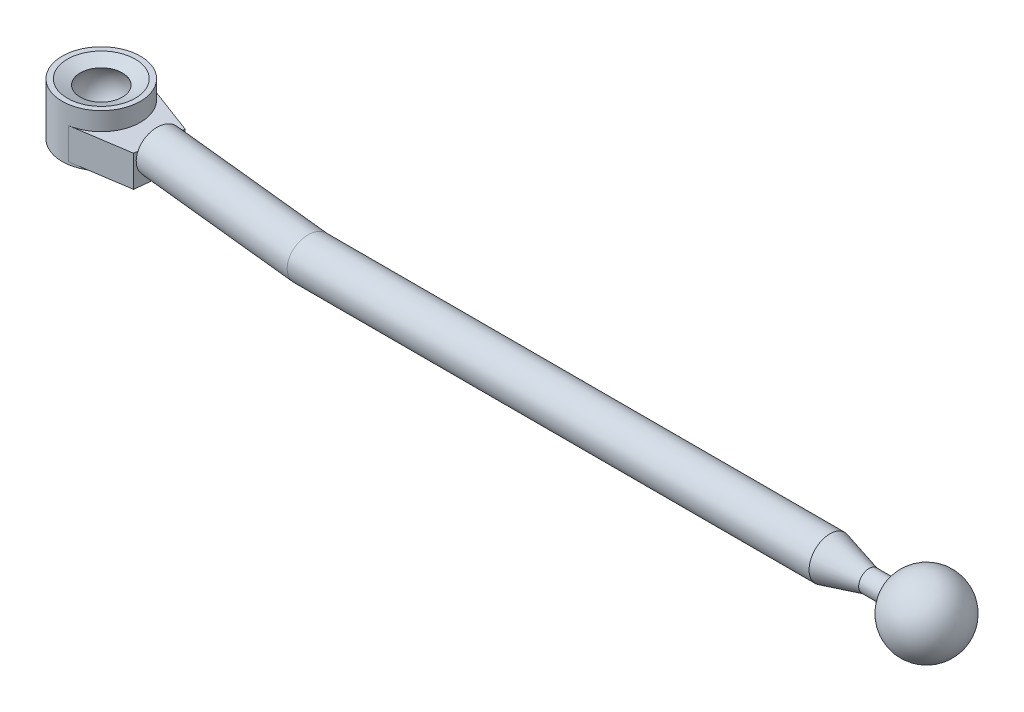
ISO-10303-21;
HEADER;
FILE_DESCRIPTION(('STEP AP214'),'2;1');
FILE_NAME('part.step','',(''),(''),'','','');
FILE_SCHEMA(('AUTOMOTIVE_DESIGN { 1 0 10303 214 1 1 1 1 }'));
ENDSEC;
DATA;
#1=APPLICATION_CONTEXT('core data for automotive mechanical design processes');
#2=APPLICATION_PROTOCOL_DEFINITION('international standard','automotive_design',2000,#1);
#3=PRODUCT_CONTEXT('',#1,'mechanical');
#4=PRODUCT('Part','Part','',(#3));
#5=PRODUCT_RELATED_PRODUCT_CATEGORY('part','',(#4));
#6=PRODUCT_DEFINITION_FORMATION('','',#4);
#7=PRODUCT_DEFINITION_CONTEXT('part definition',#1,'design');
#8=PRODUCT_DEFINITION('design','',#6,#7);
#9=PRODUCT_DEFINITION_SHAPE('','',#8);
#10=(LENGTH_UNIT() NAMED_UNIT(*) SI_UNIT(.MILLI.,.METRE.));
#11=(NAMED_UNIT(*) PLANE_ANGLE_UNIT() SI_UNIT($,.RADIAN.));
#12=(NAMED_UNIT(*) SI_UNIT($,.STERADIAN.) SOLID_ANGLE_UNIT());
#13=UNCERTAINTY_MEASURE_WITH_UNIT(LENGTH_MEASURE(1.E-05),#10,'distance_accuracy_value','');
#14=(GEOMETRIC_REPRESENTATION_CONTEXT(3) GLOBAL_UNCERTAINTY_ASSIGNED_CONTEXT((#13)) GLOBAL_UNIT_ASSIGNED_CONTEXT((#10,
#11,#12)) REPRESENTATION_CONTEXT('',''));
#15=CARTESIAN_POINT('',(0.,0.,0.));
#16=DIRECTION('',(0.,0.,1.));
#17=DIRECTION('',(1.,0.,0.));
#18=AXIS2_PLACEMENT_3D('',#15,#16,#17);
#19=CARTESIAN_POINT('',(-237.,0.,0.));
#20=DIRECTION('',(0.,0.,1.));
#21=DIRECTION('',(0.,1.,0.));
#22=AXIS2_PLACEMENT_3D('',#19,#20,#21);
#23=SPHERICAL_SURFACE('',#22,14.);
#24=CARTESIAN_POINT('',(-237.,0.,0.));
#25=DIRECTION('',(-1.,0.,0.));
#26=DIRECTION('',(0.,0.,1.));
#27=AXIS2_PLACEMENT_3D('',#24,#25,#26);
#28=SPHERICAL_SURFACE('',#27,14.);
#29=CARTESIAN_POINT('',(-250.416407864999,0.,0.));
#30=DIRECTION('',(-0.999999999999999,0.,0.));
#31=DIRECTION('',(0.,0.,1.));
#32=AXIS2_PLACEMENT_3D('',#29,#30,#31);
#33=CIRCLE('',#32,4.);
#34=CARTESIAN_POINT('',(-250.416407864999,0.,4.));
#35=VERTEX_POINT('',#34);
#36=EDGE_CURVE('E164',#35,#35,#33,.F.);
#37=ORIENTED_EDGE('',*,*,#36,.T.);
#38=EDGE_LOOP('',(#37));
#39=FACE_BOUND('',#38,.T.);
#40=ADVANCED_FACE('F41',(#39),#28,.T.);
#41=CARTESIAN_POINT('',(-259.,0.,0.));
#42=DIRECTION('',(1.,0.,0.));
#43=DIRECTION('',(0.,0.,1.));
#44=AXIS2_PLACEMENT_3D('',#41,#42,#43);
#45=CYLINDRICAL_SURFACE('',#44,4.);
#46=CARTESIAN_POINT('',(-259.,0.,0.));
#47=DIRECTION('',(1.,0.,0.));
#48=DIRECTION('',(0.,0.,-1.));
#49=AXIS2_PLACEMENT_3D('',#46,#47,#48);
#50=CIRCLE('',#49,4.);
#51=CARTESIAN_POINT('',(-259.,0.,-4.));
#52=VERTEX_POINT('',#51);
#53=EDGE_CURVE('E167',#52,#52,#50,.T.);
#54=ORIENTED_EDGE('',*,*,#53,.T.);
#55=EDGE_LOOP('',(#54));
#56=FACE_BOUND('',#55,.T.);
#57=ORIENTED_EDGE('',*,*,#36,.F.);
#58=EDGE_LOOP('',(#57));
#59=FACE_BOUND('',#58,.T.);
#60=ADVANCED_FACE('F153',(#56,#59),#45,.T.);
#61=CARTESIAN_POINT('',(-259.,0.,0.));
#62=DIRECTION('',(-1.,0.,0.));
#63=DIRECTION('',(0.,0.,-1.));
#64=AXIS2_PLACEMENT_3D('',#61,#62,#63);
#65=CONICAL_SURFACE('',#64,4.,0.261799387799149);
#66=CARTESIAN_POINT('',(-274.,0.,0.));
#67=DIRECTION('',(1.,0.,0.));
#68=DIRECTION('',(0.,0.,-1.));
#69=AXIS2_PLACEMENT_3D('',#66,#67,#68);
#70=CIRCLE('',#69,8.01923788646685);
#71=CARTESIAN_POINT('',(-274.,0.,-8.01923788646685));
#72=VERTEX_POINT('',#71);
#73=EDGE_CURVE('E135',#72,#72,#70,.T.);
#74=ORIENTED_EDGE('',*,*,#73,.T.);
#75=EDGE_LOOP('',(#74));
#76=FACE_BOUND('',#75,.T.);
#77=ORIENTED_EDGE('',*,*,#53,.F.);
#78=EDGE_LOOP('',(#77));
#79=FACE_BOUND('',#78,.T.);
#80=ADVANCED_FACE('F149',(#76,#79),#65,.T.);
#81=CARTESIAN_POINT('',(-474.,0.,0.));
#82=DIRECTION('',(1.,0.,0.));
#83=DIRECTION('',(0.,0.,1.));
#84=AXIS2_PLACEMENT_3D('',#81,#82,#83);
#85=CYLINDRICAL_SURFACE('',#84,8.01923788646685);
#86=CARTESIAN_POINT('',(-473.15714413453,0.,0.));
#87=DIRECTION('',(0.994521895368274,0.,0.104528463267644));
#88=DIRECTION('',(0.104528463267644,0.,-0.994521895368274));
#89=AXIS2_PLACEMENT_3D('',#86,#87,#88);
#90=ELLIPSE('',#89,8.06341009063184,8.01923788646685);
#91=CARTESIAN_POINT('',(-472.314288269059,0.,-8.01923788646685));
#92=VERTEX_POINT('',#91);
#93=EDGE_CURVE('E130',#92,#92,#90,.T.);
#94=ORIENTED_EDGE('',*,*,#93,.T.);
#95=EDGE_LOOP('',(#94));
#96=FACE_BOUND('',#95,.T.);
#97=ORIENTED_EDGE('',*,*,#73,.F.);
#98=EDGE_LOOP('',(#97));
#99=FACE_BOUND('',#98,.T.);
#100=ADVANCED_FACE('F144',(#96,#99),#85,.T.);
#101=CARTESIAN_POINT('',(-537.801067333467,0.,-6.79435011239686));
#102=DIRECTION('',(0.994521895368274,0.,0.104528463267644));
#103=DIRECTION('',(0.104528463267644,0.,-0.994521895368274));
#104=AXIS2_PLACEMENT_3D('',#101,#102,#103);
#105=ELLIPSE('',#104,8.06341009063184,8.01923788646685);
#106=DIRECTION('',(0.994521895368274,0.,0.104528463267644));
#107=VECTOR('',#106,1.);
#108=SURFACE_OF_LINEAR_EXTRUSION('',#105,#107);
#109=CARTESIAN_POINT('',(-537.019412737421,3.,-14.231296816505));
#110=VERTEX_POINT('',#109);
#111=CARTESIAN_POINT('',(-538.582721929514,3.,0.642596591711303));
#112=VERTEX_POINT('',#111);
#113=EDGE_CURVE('E131',#110,#112,#105,.T.);
#114=ORIENTED_EDGE('',*,*,#113,.T.);
#115=EDGE_CURVE('E136',#112,#110,#105,.T.);
#116=ORIENTED_EDGE('',*,*,#115,.T.);
#117=EDGE_LOOP('',(#114,#116));
#118=FACE_BOUND('',#117,.T.);
#119=ORIENTED_EDGE('',*,*,#93,.F.);
#120=EDGE_LOOP('',(#119));
#121=FACE_BOUND('',#120,.T.);
#122=ADVANCED_FACE('F139',(#118,#121),#108,.T.);
#123=CARTESIAN_POINT('',(-537.801067333467,0.,-6.79435011239686));
#124=DIRECTION('',(-0.994521895368274,0.,-0.104528463267644));
#125=DIRECTION('',(0.104528463267644,0.,-0.994521895368274));
#126=AXIS2_PLACEMENT_3D('',#123,#124,#125);
#127=PLANE('',#126);
#128=DIRECTION('',(-0.104528463267639,0.,0.994521895368275));
#129=VECTOR('',#128,1.);
#130=CARTESIAN_POINT('',(-538.741823502876,3.,2.15634694591763));
#131=LINE('',#130,#129);
#132=EDGE_CURVE('E166',#110,#112,#131,.T.);
#133=ORIENTED_EDGE('',*,*,#132,.T.);
#134=ORIENTED_EDGE('',*,*,#113,.F.);
#135=EDGE_LOOP('',(#133,#134));
#136=FACE_BOUND('',#135,.T.);
#137=ADVANCED_FACE('F143',(#136),#127,.T.);
#138=CARTESIAN_POINT('',(-538.741823502876,3.,2.15634694591763));
#139=DIRECTION('',(-0.994521895368275,0.,-0.104528463267639));
#140=DIRECTION('',(0.104528463267639,0.,-0.994521895368275));
#141=AXIS2_PLACEMENT_3D('',#138,#139,#140);
#142=PLANE('',#141);
#143=CARTESIAN_POINT('',(-538.741823502876,3.,2.15634694591763));
#144=VERTEX_POINT('',#143);
#145=EDGE_CURVE('E63',#112,#144,#131,.T.);
#146=ORIENTED_EDGE('',*,*,#145,.T.);
#147=DIRECTION('',(0.,-1.,0.));
#148=VECTOR('',#147,1.);
#149=CARTESIAN_POINT('',(-538.741823502876,3.,2.15634694591763));
#150=LINE('',#149,#148);
#151=CARTESIAN_POINT('',(-538.741823502876,-9.,2.15634694591763));
#152=VERTEX_POINT('',#151);
#153=EDGE_CURVE('E126',#144,#152,#150,.T.);
#154=ORIENTED_EDGE('',*,*,#153,.T.);
#155=DIRECTION('',(-0.104528463267639,0.,0.994521895368275));
#156=VECTOR('',#155,1.);
#157=CARTESIAN_POINT('',(-538.741823502876,-9.,2.15634694591763));
#158=LINE('',#157,#156);
#159=CARTESIAN_POINT('',(-536.860311164059,-9.,-15.7450471707113));
#160=VERTEX_POINT('',#159);
#161=EDGE_CURVE('E114',#160,#152,#158,.T.);
#162=ORIENTED_EDGE('',*,*,#161,.F.);
#163=DIRECTION('',(0.,-1.,0.));
#164=VECTOR('',#163,1.);
#165=CARTESIAN_POINT('',(-536.860311164059,3.,-15.7450471707113));
#166=LINE('',#165,#164);
#167=CARTESIAN_POINT('',(-536.860311164059,3.,-15.7450471707113));
#168=VERTEX_POINT('',#167);
#169=EDGE_CURVE('E112',#168,#160,#166,.T.);
#170=ORIENTED_EDGE('',*,*,#169,.F.);
#171=EDGE_CURVE('E56',#168,#110,#131,.T.);
#172=ORIENTED_EDGE('',*,*,#171,.T.);
#173=ORIENTED_EDGE('',*,*,#115,.F.);
#174=EDGE_LOOP('',(#146,#154,#162,#170,#172,#173));
#175=FACE_BOUND('',#174,.T.);
#176=ADVANCED_FACE('F204',(#175),#142,.F.);
#177=CARTESIAN_POINT('',(-536.860311164059,3.,-15.7450471707113));
#178=DIRECTION('',(-0.351367061986771,0.,0.936237783765847));
#179=DIRECTION('',(-0.936237783765847,0.,-0.351367061986771));
#180=AXIS2_PLACEMENT_3D('',#177,#178,#179);
#181=PLANE('',#180);
#182=DIRECTION('',(0.936237783765847,0.,0.351367061986771));
#183=VECTOR('',#182,1.);
#184=CARTESIAN_POINT('',(-536.860311164059,-9.,-15.7450471707113));
#185=LINE('',#184,#183);
#186=CARTESIAN_POINT('',(-557.393608787873,-9.,-23.4511284505755));
#187=VERTEX_POINT('',#186);
#188=EDGE_CURVE('E94',#187,#160,#185,.T.);
#189=ORIENTED_EDGE('',*,*,#188,.F.);
#190=DIRECTION('',(0.,-1.,0.));
#191=VECTOR('',#190,1.);
#192=CARTESIAN_POINT('',(-557.393608787873,3.,-23.4511284505755));
#193=LINE('',#192,#191);
#194=CARTESIAN_POINT('',(-557.393608787873,3.,-23.4511284505755));
#195=VERTEX_POINT('',#194);
#196=EDGE_CURVE('E103',#195,#187,#193,.T.);
#197=ORIENTED_EDGE('',*,*,#196,.F.);
#198=DIRECTION('',(0.936237783765847,0.,0.351367061986771));
#199=VECTOR('',#198,1.);
#200=CARTESIAN_POINT('',(-536.860311164059,3.,-15.7450471707113));
#201=LINE('',#200,#199);
#202=EDGE_CURVE('E100',#195,#168,#201,.T.);
#203=ORIENTED_EDGE('',*,*,#202,.T.);
#204=ORIENTED_EDGE('',*,*,#169,.T.);
#205=EDGE_LOOP('',(#189,#197,#203,#204));
#206=FACE_BOUND('',#205,.T.);
#207=ADVANCED_FACE('F111',(#206),#181,.F.);
#208=CARTESIAN_POINT('',(-538.741823502876,3.,2.15634694591763));
#209=DIRECTION('',(-0.149034068029049,0.,-0.988832061862232));
#210=DIRECTION('',(0.988832061862232,0.,-0.149034068029049));
#211=AXIS2_PLACEMENT_3D('',#208,#209,#210);
#212=PLANE('',#211);
#213=DIRECTION('',(-0.988832061862232,0.,0.149034068029049));
#214=VECTOR('',#213,1.);
#215=CARTESIAN_POINT('',(-538.741823502876,-9.,2.15634694591763));
#216=LINE('',#215,#214);
#217=CARTESIAN_POINT('',(-560.428603697239,-9.,5.42491923384569));
#218=VERTEX_POINT('',#217);
#219=EDGE_CURVE('E96',#152,#218,#216,.T.);
#220=ORIENTED_EDGE('',*,*,#219,.F.);
#221=ORIENTED_EDGE('',*,*,#153,.F.);
#222=DIRECTION('',(-0.988832061862232,0.,0.149034068029049));
#223=VECTOR('',#222,1.);
#224=CARTESIAN_POINT('',(-538.741823502876,3.,2.15634694591763));
#225=LINE('',#224,#223);
#226=CARTESIAN_POINT('',(-560.428603697239,3.,5.42491923384569));
#227=VERTEX_POINT('',#226);
#228=EDGE_CURVE('E310',#144,#227,#225,.T.);
#229=ORIENTED_EDGE('',*,*,#228,.T.);
#230=DIRECTION('',(0.,-1.,0.));
#231=VECTOR('',#230,1.);
#232=CARTESIAN_POINT('',(-560.428603697239,3.,5.42491923384569));
#233=LINE('',#232,#231);
#234=EDGE_CURVE('E109',#227,#218,#233,.T.);
#235=ORIENTED_EDGE('',*,*,#234,.T.);
#236=EDGE_LOOP('',(#220,#221,#229,#235));
#237=FACE_BOUND('',#236,.T.);
#238=ADVANCED_FACE('F198',(#237),#212,.F.);
#239=CARTESIAN_POINT('',(-562.664114717674,3.,-9.40756169408781));
#240=DIRECTION('',(0.,1.,0.));
#241=DIRECTION('',(0.,0.,1.));
#242=AXIS2_PLACEMENT_3D('',#239,#240,#241);
#243=PLANE('',#242);
#244=ORIENTED_EDGE('',*,*,#202,.F.);
#245=CARTESIAN_POINT('',(-562.664114717674,3.,-9.40756169408781));
#246=DIRECTION('',(0.,1.,0.));
#247=DIRECTION('',(0.,0.,1.));
#248=AXIS2_PLACEMENT_3D('',#245,#246,#247);
#249=CIRCLE('',#248,15.);
#250=EDGE_CURVE('E106',#227,#195,#249,.T.);
#251=ORIENTED_EDGE('',*,*,#250,.F.);
#252=ORIENTED_EDGE('',*,*,#228,.F.);
#253=ORIENTED_EDGE('',*,*,#145,.F.);
#254=ORIENTED_EDGE('',*,*,#132,.F.);
#255=ORIENTED_EDGE('',*,*,#171,.F.);
#256=EDGE_LOOP('',(#244,#251,#252,#253,#254,#255));
#257=FACE_BOUND('',#256,.T.);
#258=ADVANCED_FACE('F195',(#257),#243,.T.);
#259=CARTESIAN_POINT('',(-562.664114717674,-9.,-9.40756169408781));
#260=DIRECTION('',(0.,1.,0.));
#261=DIRECTION('',(0.,0.,1.));
#262=AXIS2_PLACEMENT_3D('',#259,#260,#261);
#263=PLANE('',#262);
#264=ORIENTED_EDGE('',*,*,#188,.T.);
#265=ORIENTED_EDGE('',*,*,#161,.T.);
#266=ORIENTED_EDGE('',*,*,#219,.T.);
#267=CARTESIAN_POINT('',(-562.664114717674,-9.,-9.40756169408781));
#268=DIRECTION('',(0.,1.,0.));
#269=DIRECTION('',(0.,0.,1.));
#270=AXIS2_PLACEMENT_3D('',#267,#268,#269);
#271=CIRCLE('',#270,15.);
#272=EDGE_CURVE('E89',#218,#187,#271,.T.);
#273=ORIENTED_EDGE('',*,*,#272,.T.);
#274=EDGE_LOOP('',(#264,#265,#266,#273));
#275=FACE_BOUND('',#274,.T.);
#276=ADVANCED_FACE('F91',(#275),#263,.F.);
#277=CARTESIAN_POINT('',(-562.664114717674,10.,-9.40756169408781));
#278=DIRECTION('',(0.,-1.,0.));
#279=DIRECTION('',(0.,0.,-1.));
#280=AXIS2_PLACEMENT_3D('',#277,#278,#279);
#281=CYLINDRICAL_SURFACE('',#280,15.);
#282=ORIENTED_EDGE('',*,*,#250,.T.);
#283=ORIENTED_EDGE('',*,*,#196,.T.);
#284=ORIENTED_EDGE('',*,*,#272,.F.);
#285=ORIENTED_EDGE('',*,*,#234,.F.);
#286=EDGE_LOOP('',(#282,#283,#284,#285));
#287=FACE_BOUND('',#286,.T.);
#288=CARTESIAN_POINT('',(-562.664114717674,10.,-9.40756169408781));
#289=DIRECTION('',(0.,-1.,0.));
#290=DIRECTION('',(0.,0.,1.));
#291=AXIS2_PLACEMENT_3D('',#288,#289,#290);
#292=CIRCLE('',#291,15.);
#293=CARTESIAN_POINT('',(-562.664114717674,10.,5.59243830591222));
#294=VERTEX_POINT('',#293);
#295=EDGE_CURVE('E115',#294,#294,#292,.T.);
#296=ORIENTED_EDGE('',*,*,#295,.T.);
#297=EDGE_LOOP('',(#296));
#298=FACE_BOUND('',#297,.T.);
#299=CARTESIAN_POINT('',(-562.664114717674,-10.,-9.40756169408781));
#300=DIRECTION('',(0.,-1.,0.));
#301=DIRECTION('',(0.,0.,1.));
#302=AXIS2_PLACEMENT_3D('',#299,#300,#301);
#303=CIRCLE('',#302,15.);
#304=CARTESIAN_POINT('',(-562.664114717674,-10.,5.59243830591222));
#305=VERTEX_POINT('',#304);
#306=EDGE_CURVE('E119',#305,#305,#303,.T.);
#307=ORIENTED_EDGE('',*,*,#306,.F.);
#308=EDGE_LOOP('',(#307));
#309=FACE_BOUND('',#308,.T.);
#310=ADVANCED_FACE('F104',(#287,#298,#309),#281,.T.);
#311=CARTESIAN_POINT('',(-562.664114717674,10.,-9.40756169408781));
#312=DIRECTION('',(0.,1.,0.));
#313=DIRECTION('',(0.,0.,1.));
#314=AXIS2_PLACEMENT_3D('',#311,#312,#313);
#315=PLANE('',#314);
#316=CARTESIAN_POINT('',(-562.664114717674,10.,-9.40756169408781));
#317=DIRECTION('',(0.,-1.,0.));
#318=DIRECTION('',(0.,0.,1.));
#319=AXIS2_PLACEMENT_3D('',#316,#317,#318);
#320=CIRCLE('',#319,13.);
#321=CARTESIAN_POINT('',(-562.664114717674,10.,3.59243830591219));
#322=VERTEX_POINT('',#321);
#323=EDGE_CURVE('E11',#322,#322,#320,.F.);
#324=ORIENTED_EDGE('',*,*,#323,.F.);
#325=EDGE_LOOP('',(#324));
#326=FACE_BOUND('',#325,.T.);
#327=ORIENTED_EDGE('',*,*,#295,.F.);
#328=EDGE_LOOP('',(#327));
#329=FACE_BOUND('',#328,.T.);
#330=ADVANCED_FACE('F186',(#326,#329),#315,.T.);
#331=CARTESIAN_POINT('',(-562.664114717674,-10.,-9.40756169408781));
#332=DIRECTION('',(0.,1.,0.));
#333=DIRECTION('',(0.,0.,1.));
#334=AXIS2_PLACEMENT_3D('',#331,#332,#333);
#335=PLANE('',#334);
#336=ORIENTED_EDGE('',*,*,#306,.T.);
#337=EDGE_LOOP('',(#336));
#338=FACE_BOUND('',#337,.T.);
#339=ADVANCED_FACE('F178',(#338),#335,.F.);
#340=CARTESIAN_POINT('',(-562.664114717674,2.,-9.40756169408781));
#341=DIRECTION('',(-1.,0.,0.));
#342=DIRECTION('',(0.,0.,-1.));
#343=AXIS2_PLACEMENT_3D('',#340,#341,#342);
#344=SPHERICAL_SURFACE('',#343,10.);
#345=CARTESIAN_POINT('',(-562.664114717674,2.,-9.40756169408781));
#346=DIRECTION('',(0.,1.,0.));
#347=DIRECTION('',(0.,0.,-1.));
#348=AXIS2_PLACEMENT_3D('',#345,#346,#347);
#349=SPHERICAL_SURFACE('',#348,10.);
#350=CARTESIAN_POINT('',(-562.664114717674,7.90690661320976,-9.40756169408781));
#351=DIRECTION('',(0.,1.,0.));
#352=DIRECTION('',(0.,0.,-1.));
#353=AXIS2_PLACEMENT_3D('',#350,#351,#352);
#354=CIRCLE('',#353,8.06898099284036);
#355=CARTESIAN_POINT('',(-562.664114717674,7.90690661320976,-17.4765426869282));
#356=VERTEX_POINT('',#355);
#357=EDGE_CURVE('E49',#356,#356,#354,.F.);
#358=ORIENTED_EDGE('',*,*,#357,.F.);
#359=EDGE_LOOP('',(#358));
#360=FACE_BOUND('',#359,.T.);
#361=ADVANCED_FACE('F176',(#360),#349,.F.);
#362=CARTESIAN_POINT('',(-562.664114717674,7.90690661320976,-9.40756169408781));
#363=DIRECTION('',(0.,1.,0.));
#364=DIRECTION('',(0.,0.,1.));
#365=AXIS2_PLACEMENT_3D('',#362,#363,#364);
#366=CONICAL_SURFACE('',#365,8.06898099284036,1.16937059883619);
#367=ORIENTED_EDGE('',*,*,#323,.T.);
#368=EDGE_LOOP('',(#367));
#369=FACE_BOUND('',#368,.T.);
#370=ORIENTED_EDGE('',*,*,#357,.T.);
#371=EDGE_LOOP('',(#370));
#372=FACE_BOUND('',#371,.T.);
#373=ADVANCED_FACE('F43',(#369,#372),#366,.F.);
#374=CLOSED_SHELL('',(#40,#60,#80,#100,#122,#137,#176,#207,#238,#258,#276,#310,#330,#339,#361,#373));
#375=MANIFOLD_SOLID_BREP('B2',#374);
#376=ADVANCED_BREP_SHAPE_REPRESENTATION('',(#18,#375),#14);
#377=SHAPE_DEFINITION_REPRESENTATION(#9,#376);
ENDSEC;
END-ISO-10303-21;
